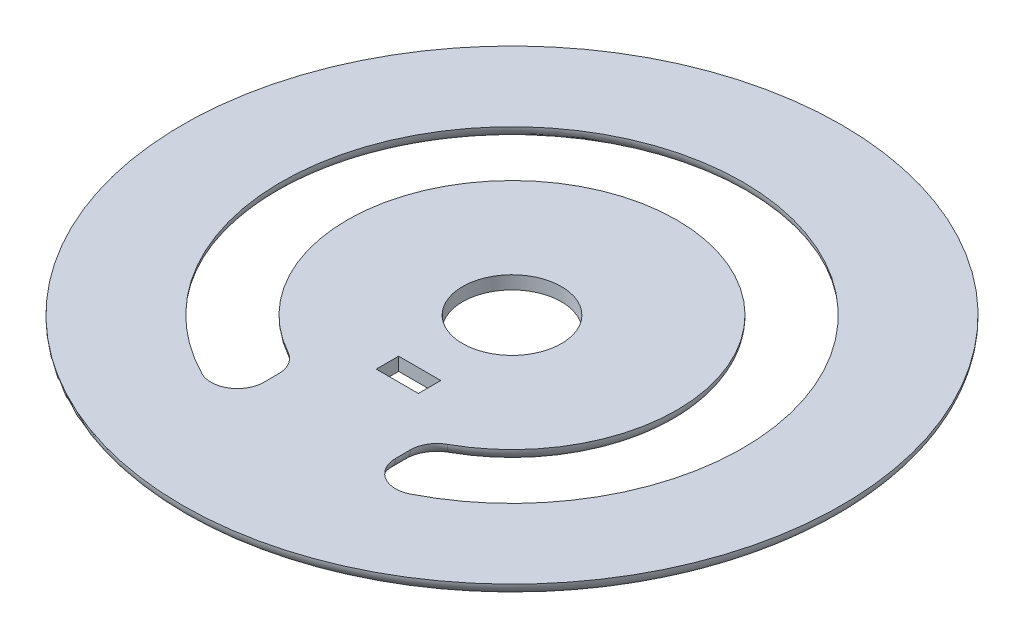
ISO-10303-21;
HEADER;
FILE_DESCRIPTION(('STEP AP214'),'2;1');
FILE_NAME('part.step','',(''),(''),'','','');
FILE_SCHEMA(('AUTOMOTIVE_DESIGN { 1 0 10303 214 1 1 1 1 }'));
ENDSEC;
DATA;
#1=APPLICATION_CONTEXT('core data for automotive mechanical design processes');
#2=APPLICATION_PROTOCOL_DEFINITION('international standard','automotive_design',2000,#1);
#3=PRODUCT_CONTEXT('',#1,'mechanical');
#4=PRODUCT('Part','Part','',(#3));
#5=PRODUCT_RELATED_PRODUCT_CATEGORY('part','',(#4));
#6=PRODUCT_DEFINITION_FORMATION('','',#4);
#7=PRODUCT_DEFINITION_CONTEXT('part definition',#1,'design');
#8=PRODUCT_DEFINITION('design','',#6,#7);
#9=PRODUCT_DEFINITION_SHAPE('','',#8);
#10=(LENGTH_UNIT() NAMED_UNIT(*) SI_UNIT(.MILLI.,.METRE.));
#11=(NAMED_UNIT(*) PLANE_ANGLE_UNIT() SI_UNIT($,.RADIAN.));
#12=(NAMED_UNIT(*) SI_UNIT($,.STERADIAN.) SOLID_ANGLE_UNIT());
#13=UNCERTAINTY_MEASURE_WITH_UNIT(LENGTH_MEASURE(1.E-05),#10,'distance_accuracy_value','');
#14=(GEOMETRIC_REPRESENTATION_CONTEXT(3) GLOBAL_UNCERTAINTY_ASSIGNED_CONTEXT((#13)) GLOBAL_UNIT_ASSIGNED_CONTEXT((#10,
#11,#12)) REPRESENTATION_CONTEXT('',''));
#15=CARTESIAN_POINT('',(0.,0.,0.));
#16=DIRECTION('',(0.,0.,1.));
#17=DIRECTION('',(1.,0.,0.));
#18=AXIS2_PLACEMENT_3D('',#15,#16,#17);
#19=CARTESIAN_POINT('',(0.,1.,0.));
#20=DIRECTION('',(0.,1.,0.));
#21=DIRECTION('',(0.,0.,1.));
#22=AXIS2_PLACEMENT_3D('',#19,#20,#21);
#23=PLANE('',#22);
#24=DIRECTION('',(1.,0.,0.));
#25=VECTOR('',#24,1.);
#26=CARTESIAN_POINT('',(-1.6,1.,8.7));
#27=LINE('',#26,#25);
#28=CARTESIAN_POINT('',(-1.6,1.,8.7));
#29=VERTEX_POINT('',#28);
#30=CARTESIAN_POINT('',(1.6,1.,8.7));
#31=VERTEX_POINT('',#30);
#32=EDGE_CURVE('E134',#29,#31,#27,.T.);
#33=ORIENTED_EDGE('',*,*,#32,.F.);
#34=DIRECTION('',(0.,0.,1.));
#35=VECTOR('',#34,1.);
#36=CARTESIAN_POINT('',(-1.6,1.,7.));
#37=LINE('',#36,#35);
#38=CARTESIAN_POINT('',(-1.6,1.,7.));
#39=VERTEX_POINT('',#38);
#40=EDGE_CURVE('E124',#39,#29,#37,.T.);
#41=ORIENTED_EDGE('',*,*,#40,.F.);
#42=DIRECTION('',(-1.,0.,0.));
#43=VECTOR('',#42,1.);
#44=CARTESIAN_POINT('',(-1.6,1.,7.));
#45=LINE('',#44,#43);
#46=CARTESIAN_POINT('',(1.6,1.,7.));
#47=VERTEX_POINT('',#46);
#48=EDGE_CURVE('E150',#47,#39,#45,.T.);
#49=ORIENTED_EDGE('',*,*,#48,.F.);
#50=DIRECTION('',(0.,0.,-1.));
#51=VECTOR('',#50,1.);
#52=CARTESIAN_POINT('',(1.6,1.,7.));
#53=LINE('',#52,#51);
#54=EDGE_CURVE('E148',#31,#47,#53,.T.);
#55=ORIENTED_EDGE('',*,*,#54,.F.);
#56=EDGE_LOOP('',(#33,#41,#49,#55));
#57=FACE_BOUND('',#56,.T.);
#58=CARTESIAN_POINT('',(0.,1.,0.));
#59=DIRECTION('',(0.,1.,0.));
#60=DIRECTION('',(0.,0.,1.));
#61=AXIS2_PLACEMENT_3D('',#58,#59,#60);
#62=CIRCLE('',#61,25.);
#63=CARTESIAN_POINT('',(0.,1.,25.));
#64=VERTEX_POINT('',#63);
#65=EDGE_CURVE('E142',#64,#64,#62,.T.);
#66=ORIENTED_EDGE('',*,*,#65,.T.);
#67=EDGE_LOOP('',(#66));
#68=FACE_BOUND('',#67,.T.);
#69=CARTESIAN_POINT('',(0.,1.,0.));
#70=DIRECTION('',(0.,1.,0.));
#71=DIRECTION('',(0.,0.,1.));
#72=AXIS2_PLACEMENT_3D('',#69,#70,#71);
#73=CIRCLE('',#72,3.75);
#74=CARTESIAN_POINT('',(0.,1.,3.75));
#75=VERTEX_POINT('',#74);
#76=EDGE_CURVE('E157',#75,#75,#73,.T.);
#77=ORIENTED_EDGE('',*,*,#76,.F.);
#78=EDGE_LOOP('',(#77));
#79=FACE_BOUND('',#78,.T.);
#80=DIRECTION('',(0.,0.,1.));
#81=VECTOR('',#80,1.);
#82=CARTESIAN_POINT('',(5.,1.,11.4564392373896));
#83=LINE('',#82,#81);
#84=CARTESIAN_POINT('',(5.,1.,12.6984250992003));
#85=VERTEX_POINT('',#84);
#86=CARTESIAN_POINT('',(5.,1.,13.8293166859393));
#87=VERTEX_POINT('',#86);
#88=EDGE_CURVE('E221',#85,#87,#83,.T.);
#89=ORIENTED_EDGE('',*,*,#88,.F.);
#90=CARTESIAN_POINT('',(7.,1.,12.6984250992003));
#91=DIRECTION('',(0.,1.,0.));
#92=DIRECTION('',(0.,0.,1.));
#93=AXIS2_PLACEMENT_3D('',#90,#91,#92);
#94=CIRCLE('',#93,2.);
#95=CARTESIAN_POINT('',(6.03448275862069,1.,10.9469181889658));
#96=VERTEX_POINT('',#95);
#97=EDGE_CURVE('E175',#85,#96,#94,.F.);
#98=ORIENTED_EDGE('',*,*,#97,.T.);
#99=CARTESIAN_POINT('',(0.,1.,0.));
#100=DIRECTION('',(0.,-1.,0.));
#101=DIRECTION('',(0.,0.,1.));
#102=AXIS2_PLACEMENT_3D('',#99,#100,#101);
#103=CIRCLE('',#102,12.5);
#104=CARTESIAN_POINT('',(-6.03448275862069,1.,10.9469181889658));
#105=VERTEX_POINT('',#104);
#106=EDGE_CURVE('E216',#105,#96,#103,.T.);
#107=ORIENTED_EDGE('',*,*,#106,.F.);
#108=CARTESIAN_POINT('',(-7.,1.,12.6984250992003));
#109=DIRECTION('',(0.,1.,0.));
#110=DIRECTION('',(0.,0.,1.));
#111=AXIS2_PLACEMENT_3D('',#108,#109,#110);
#112=CIRCLE('',#111,2.);
#113=CARTESIAN_POINT('',(-5.,1.,12.6984250992003));
#114=VERTEX_POINT('',#113);
#115=EDGE_CURVE('E177',#105,#114,#112,.F.);
#116=ORIENTED_EDGE('',*,*,#115,.T.);
#117=DIRECTION('',(0.,0.,-1.));
#118=VECTOR('',#117,1.);
#119=CARTESIAN_POINT('',(-5.,1.,11.4564392373896));
#120=LINE('',#119,#118);
#121=CARTESIAN_POINT('',(-5.,1.,13.8293166859393));
#122=VERTEX_POINT('',#121);
#123=EDGE_CURVE('E230',#122,#114,#120,.T.);
#124=ORIENTED_EDGE('',*,*,#123,.F.);
#125=CARTESIAN_POINT('',(-7.,1.,13.8293166859393));
#126=DIRECTION('',(0.,1.,0.));
#127=DIRECTION('',(0.,0.,1.));
#128=AXIS2_PLACEMENT_3D('',#125,#126,#127);
#129=CIRCLE('',#128,2.);
#130=CARTESIAN_POINT('',(-7.90322580645161,1.,15.6137446454154));
#131=VERTEX_POINT('',#130);
#132=EDGE_CURVE('E173',#122,#131,#129,.F.);
#133=ORIENTED_EDGE('',*,*,#132,.T.);
#134=CARTESIAN_POINT('',(0.,1.,0.));
#135=DIRECTION('',(0.,1.,0.));
#136=DIRECTION('',(0.,0.,1.));
#137=AXIS2_PLACEMENT_3D('',#134,#135,#136);
#138=CIRCLE('',#137,17.5);
#139=CARTESIAN_POINT('',(7.90322580645162,1.,15.6137446454154));
#140=VERTEX_POINT('',#139);
#141=EDGE_CURVE('E225',#140,#131,#138,.T.);
#142=ORIENTED_EDGE('',*,*,#141,.F.);
#143=CARTESIAN_POINT('',(7.,1.,13.8293166859393));
#144=DIRECTION('',(0.,1.,0.));
#145=DIRECTION('',(0.,0.,1.));
#146=AXIS2_PLACEMENT_3D('',#143,#144,#145);
#147=CIRCLE('',#146,2.);
#148=EDGE_CURVE('E170',#140,#87,#147,.F.);
#149=ORIENTED_EDGE('',*,*,#148,.T.);
#150=EDGE_LOOP('',(#89,#98,#107,#116,#124,#133,#142,#149));
#151=FACE_BOUND('',#150,.T.);
#152=ADVANCED_FACE('F34',(#57,#68,#79,#151),#23,.T.);
#153=CARTESIAN_POINT('',(0.,0.,0.));
#154=DIRECTION('',(0.,1.,0.));
#155=DIRECTION('',(0.,0.,1.));
#156=AXIS2_PLACEMENT_3D('',#153,#154,#155);
#157=PLANE('',#156);
#158=DIRECTION('',(0.,0.,1.));
#159=VECTOR('',#158,1.);
#160=CARTESIAN_POINT('',(4.,0.,13.8293166859393));
#161=LINE('',#160,#159);
#162=CARTESIAN_POINT('',(4.,0.,12.6984250992003));
#163=VERTEX_POINT('',#162);
#164=CARTESIAN_POINT('',(4.,0.,13.8293166859393));
#165=VERTEX_POINT('',#164);
#166=EDGE_CURVE('E43',#163,#165,#161,.T.);
#167=ORIENTED_EDGE('',*,*,#166,.T.);
#168=CARTESIAN_POINT('',(7.,0.,13.8293166859393));
#169=DIRECTION('',(0.,1.,0.));
#170=DIRECTION('',(0.,0.,1.));
#171=AXIS2_PLACEMENT_3D('',#168,#169,#170);
#172=CIRCLE('',#171,3.);
#173=CARTESIAN_POINT('',(8.35483870967742,0.,16.5059586251534));
#174=VERTEX_POINT('',#173);
#175=EDGE_CURVE('E11',#165,#174,#172,.T.);
#176=ORIENTED_EDGE('',*,*,#175,.T.);
#177=CARTESIAN_POINT('',(0.,0.,0.));
#178=DIRECTION('',(0.,1.,0.));
#179=DIRECTION('',(0.,0.,1.));
#180=AXIS2_PLACEMENT_3D('',#177,#178,#179);
#181=CIRCLE('',#180,18.5);
#182=CARTESIAN_POINT('',(-8.35483870967742,0.,16.5059586251534));
#183=VERTEX_POINT('',#182);
#184=EDGE_CURVE('E182',#174,#183,#181,.T.);
#185=ORIENTED_EDGE('',*,*,#184,.T.);
#186=CARTESIAN_POINT('',(-7.,0.,13.8293166859393));
#187=DIRECTION('',(0.,1.,0.));
#188=DIRECTION('',(0.,0.,1.));
#189=AXIS2_PLACEMENT_3D('',#186,#187,#188);
#190=CIRCLE('',#189,3.);
#191=CARTESIAN_POINT('',(-4.,0.,13.8293166859393));
#192=VERTEX_POINT('',#191);
#193=EDGE_CURVE('E184',#183,#192,#190,.T.);
#194=ORIENTED_EDGE('',*,*,#193,.T.);
#195=DIRECTION('',(0.,0.,-1.));
#196=VECTOR('',#195,1.);
#197=CARTESIAN_POINT('',(-4.,0.,12.6984250992003));
#198=LINE('',#197,#196);
#199=CARTESIAN_POINT('',(-4.,0.,12.6984250992003));
#200=VERTEX_POINT('',#199);
#201=EDGE_CURVE('E186',#192,#200,#198,.T.);
#202=ORIENTED_EDGE('',*,*,#201,.T.);
#203=CARTESIAN_POINT('',(-7.,0.,12.6984250992003));
#204=DIRECTION('',(0.,1.,0.));
#205=DIRECTION('',(0.,0.,1.));
#206=AXIS2_PLACEMENT_3D('',#203,#204,#205);
#207=CIRCLE('',#206,3.);
#208=CARTESIAN_POINT('',(-5.55172413793103,0.,10.0711647338485));
#209=VERTEX_POINT('',#208);
#210=EDGE_CURVE('E188',#200,#209,#207,.T.);
#211=ORIENTED_EDGE('',*,*,#210,.T.);
#212=CARTESIAN_POINT('',(0.,0.,0.));
#213=DIRECTION('',(0.,1.,0.));
#214=DIRECTION('',(0.,0.,1.));
#215=AXIS2_PLACEMENT_3D('',#212,#213,#214);
#216=CIRCLE('',#215,11.5);
#217=CARTESIAN_POINT('',(5.55172413793104,0.,10.0711647338485));
#218=VERTEX_POINT('',#217);
#219=EDGE_CURVE('E190',#209,#218,#216,.F.);
#220=ORIENTED_EDGE('',*,*,#219,.T.);
#221=CARTESIAN_POINT('',(7.,0.,12.6984250992003));
#222=DIRECTION('',(0.,1.,0.));
#223=DIRECTION('',(0.,0.,1.));
#224=AXIS2_PLACEMENT_3D('',#221,#222,#223);
#225=CIRCLE('',#224,3.);
#226=EDGE_CURVE('E54',#218,#163,#225,.T.);
#227=ORIENTED_EDGE('',*,*,#226,.T.);
#228=EDGE_LOOP('',(#167,#176,#185,#194,#202,#211,#220,#227));
#229=FACE_BOUND('',#228,.T.);
#230=CARTESIAN_POINT('',(0.,0.,0.));
#231=DIRECTION('',(0.,1.,0.));
#232=DIRECTION('',(0.,0.,1.));
#233=AXIS2_PLACEMENT_3D('',#230,#231,#232);
#234=CIRCLE('',#233,24.);
#235=CARTESIAN_POINT('',(0.,0.,24.));
#236=VERTEX_POINT('',#235);
#237=EDGE_CURVE('E179',#236,#236,#234,.F.);
#238=ORIENTED_EDGE('',*,*,#237,.T.);
#239=EDGE_LOOP('',(#238));
#240=FACE_BOUND('',#239,.T.);
#241=CARTESIAN_POINT('',(0.,0.,0.));
#242=DIRECTION('',(0.,1.,0.));
#243=DIRECTION('',(0.,0.,1.));
#244=AXIS2_PLACEMENT_3D('',#241,#242,#243);
#245=CIRCLE('',#244,3.75);
#246=CARTESIAN_POINT('',(0.,0.,3.75));
#247=VERTEX_POINT('',#246);
#248=EDGE_CURVE('E232',#247,#247,#245,.T.);
#249=ORIENTED_EDGE('',*,*,#248,.T.);
#250=EDGE_LOOP('',(#249));
#251=FACE_BOUND('',#250,.T.);
#252=DIRECTION('',(0.,0.,1.));
#253=VECTOR('',#252,1.);
#254=CARTESIAN_POINT('',(-1.6,0.,7.));
#255=LINE('',#254,#253);
#256=CARTESIAN_POINT('',(-1.6,0.,7.));
#257=VERTEX_POINT('',#256);
#258=CARTESIAN_POINT('',(-1.6,0.,8.7));
#259=VERTEX_POINT('',#258);
#260=EDGE_CURVE('E155',#257,#259,#255,.T.);
#261=ORIENTED_EDGE('',*,*,#260,.T.);
#262=DIRECTION('',(1.,0.,0.));
#263=VECTOR('',#262,1.);
#264=CARTESIAN_POINT('',(-1.6,0.,8.7));
#265=LINE('',#264,#263);
#266=CARTESIAN_POINT('',(1.6,0.,8.7));
#267=VERTEX_POINT('',#266);
#268=EDGE_CURVE('E141',#259,#267,#265,.T.);
#269=ORIENTED_EDGE('',*,*,#268,.T.);
#270=DIRECTION('',(0.,0.,-1.));
#271=VECTOR('',#270,1.);
#272=CARTESIAN_POINT('',(1.6,0.,7.));
#273=LINE('',#272,#271);
#274=CARTESIAN_POINT('',(1.6,0.,7.));
#275=VERTEX_POINT('',#274);
#276=EDGE_CURVE('E159',#267,#275,#273,.T.);
#277=ORIENTED_EDGE('',*,*,#276,.T.);
#278=DIRECTION('',(-1.,0.,0.));
#279=VECTOR('',#278,1.);
#280=CARTESIAN_POINT('',(-1.6,0.,7.));
#281=LINE('',#280,#279);
#282=EDGE_CURVE('E135',#275,#257,#281,.T.);
#283=ORIENTED_EDGE('',*,*,#282,.T.);
#284=EDGE_LOOP('',(#261,#269,#277,#283));
#285=FACE_BOUND('',#284,.T.);
#286=ADVANCED_FACE('F237',(#229,#240,#251,#285),#157,.F.);
#287=CARTESIAN_POINT('',(-1.6,1.,7.));
#288=DIRECTION('',(1.,0.,0.));
#289=DIRECTION('',(0.,0.,-1.));
#290=AXIS2_PLACEMENT_3D('',#287,#288,#289);
#291=PLANE('',#290);
#292=ORIENTED_EDGE('',*,*,#260,.F.);
#293=DIRECTION('',(0.,-1.,0.));
#294=VECTOR('',#293,1.);
#295=CARTESIAN_POINT('',(-1.6,1.,7.));
#296=LINE('',#295,#294);
#297=EDGE_CURVE('E130',#39,#257,#296,.T.);
#298=ORIENTED_EDGE('',*,*,#297,.F.);
#299=ORIENTED_EDGE('',*,*,#40,.T.);
#300=DIRECTION('',(0.,-1.,0.));
#301=VECTOR('',#300,1.);
#302=CARTESIAN_POINT('',(-1.6,1.,8.7));
#303=LINE('',#302,#301);
#304=EDGE_CURVE('E127',#29,#259,#303,.T.);
#305=ORIENTED_EDGE('',*,*,#304,.T.);
#306=EDGE_LOOP('',(#292,#298,#299,#305));
#307=FACE_BOUND('',#306,.T.);
#308=ADVANCED_FACE('F126',(#307),#291,.T.);
#309=CARTESIAN_POINT('',(-1.6,1.,8.7));
#310=DIRECTION('',(0.,0.,-1.));
#311=DIRECTION('',(-1.,0.,0.));
#312=AXIS2_PLACEMENT_3D('',#309,#310,#311);
#313=PLANE('',#312);
#314=ORIENTED_EDGE('',*,*,#268,.F.);
#315=ORIENTED_EDGE('',*,*,#304,.F.);
#316=ORIENTED_EDGE('',*,*,#32,.T.);
#317=DIRECTION('',(0.,-1.,0.));
#318=VECTOR('',#317,1.);
#319=CARTESIAN_POINT('',(1.6,1.,8.7));
#320=LINE('',#319,#318);
#321=EDGE_CURVE('E143',#31,#267,#320,.T.);
#322=ORIENTED_EDGE('',*,*,#321,.T.);
#323=EDGE_LOOP('',(#314,#315,#316,#322));
#324=FACE_BOUND('',#323,.T.);
#325=ADVANCED_FACE('F138',(#324),#313,.T.);
#326=CARTESIAN_POINT('',(1.6,1.,7.));
#327=DIRECTION('',(-1.,0.,0.));
#328=DIRECTION('',(0.,0.,1.));
#329=AXIS2_PLACEMENT_3D('',#326,#327,#328);
#330=PLANE('',#329);
#331=ORIENTED_EDGE('',*,*,#276,.F.);
#332=ORIENTED_EDGE('',*,*,#321,.F.);
#333=ORIENTED_EDGE('',*,*,#54,.T.);
#334=DIRECTION('',(0.,-1.,0.));
#335=VECTOR('',#334,1.);
#336=CARTESIAN_POINT('',(1.6,1.,7.));
#337=LINE('',#336,#335);
#338=EDGE_CURVE('E165',#47,#275,#337,.T.);
#339=ORIENTED_EDGE('',*,*,#338,.T.);
#340=EDGE_LOOP('',(#331,#332,#333,#339));
#341=FACE_BOUND('',#340,.T.);
#342=ADVANCED_FACE('F252',(#341),#330,.T.);
#343=CARTESIAN_POINT('',(-1.6,1.,7.));
#344=DIRECTION('',(0.,0.,1.));
#345=DIRECTION('',(1.,0.,0.));
#346=AXIS2_PLACEMENT_3D('',#343,#344,#345);
#347=PLANE('',#346);
#348=ORIENTED_EDGE('',*,*,#282,.F.);
#349=ORIENTED_EDGE('',*,*,#338,.F.);
#350=ORIENTED_EDGE('',*,*,#48,.T.);
#351=ORIENTED_EDGE('',*,*,#297,.T.);
#352=EDGE_LOOP('',(#348,#349,#350,#351));
#353=FACE_BOUND('',#352,.T.);
#354=ADVANCED_FACE('F243',(#353),#347,.T.);
#355=CARTESIAN_POINT('',(0.,1.,0.));
#356=DIRECTION('',(0.,-1.,0.));
#357=DIRECTION('',(0.,0.,-1.));
#358=AXIS2_PLACEMENT_3D('',#355,#356,#357);
#359=CYLINDRICAL_SURFACE('',#358,3.75);
#360=ORIENTED_EDGE('',*,*,#76,.T.);
#361=EDGE_LOOP('',(#360));
#362=FACE_BOUND('',#361,.T.);
#363=ORIENTED_EDGE('',*,*,#248,.F.);
#364=EDGE_LOOP('',(#363));
#365=FACE_BOUND('',#364,.T.);
#366=ADVANCED_FACE('F240',(#362,#365),#359,.F.);
#367=CARTESIAN_POINT('',(-7.,1.,12.6984250992003));
#368=DIRECTION('',(0.,1.,0.));
#369=DIRECTION('',(0.,0.,1.));
#370=AXIS2_PLACEMENT_3D('',#367,#368,#369);
#371=TOROIDAL_SURFACE('',#370,3.,1.);
#372=CARTESIAN_POINT('',(-4.,1.,12.6984250992003));
#373=DIRECTION('',(0.,0.,1.));
#374=DIRECTION('',(1.,0.,0.));
#375=AXIS2_PLACEMENT_3D('',#372,#373,#374);
#376=CIRCLE('',#375,1.);
#377=EDGE_CURVE('E209',#114,#200,#376,.T.);
#378=ORIENTED_EDGE('',*,*,#377,.F.);
#379=ORIENTED_EDGE('',*,*,#115,.F.);
#380=CARTESIAN_POINT('',(-5.55172413793103,1.,10.0711647338485));
#381=DIRECTION('',(-0.875753455117262,0.,-0.482758620689655));
#382=DIRECTION('',(-0.482758620689655,0.,0.875753455117262));
#383=AXIS2_PLACEMENT_3D('',#380,#381,#382);
#384=CIRCLE('',#383,1.);
#385=EDGE_CURVE('E38',#209,#105,#384,.T.);
#386=ORIENTED_EDGE('',*,*,#385,.F.);
#387=ORIENTED_EDGE('',*,*,#210,.F.);
#388=EDGE_LOOP('',(#378,#379,#386,#387));
#389=FACE_BOUND('',#388,.T.);
#390=ADVANCED_FACE('F242',(#389),#371,.T.);
#391=CARTESIAN_POINT('',(0.,1.,0.));
#392=DIRECTION('',(0.,1.,0.));
#393=DIRECTION('',(0.,0.,1.));
#394=AXIS2_PLACEMENT_3D('',#391,#392,#393);
#395=TOROIDAL_SURFACE('',#394,11.5,1.);
#396=ORIENTED_EDGE('',*,*,#385,.T.);
#397=ORIENTED_EDGE('',*,*,#106,.T.);
#398=CARTESIAN_POINT('',(5.55172413793104,1.,10.0711647338485));
#399=DIRECTION('',(-0.875753455117261,0.,0.482758620689656));
#400=DIRECTION('',(0.482758620689656,0.,0.875753455117261));
#401=AXIS2_PLACEMENT_3D('',#398,#399,#400);
#402=CIRCLE('',#401,1.);
#403=EDGE_CURVE('E207',#218,#96,#402,.T.);
#404=ORIENTED_EDGE('',*,*,#403,.F.);
#405=ORIENTED_EDGE('',*,*,#219,.F.);
#406=EDGE_LOOP('',(#396,#397,#404,#405));
#407=FACE_BOUND('',#406,.T.);
#408=ADVANCED_FACE('F250',(#407),#395,.T.);
#409=CARTESIAN_POINT('',(-3.99999999999999,1.,0.));
#410=DIRECTION('',(0.,0.,1.));
#411=DIRECTION('',(1.,0.,0.));
#412=AXIS2_PLACEMENT_3D('',#409,#410,#411);
#413=CYLINDRICAL_SURFACE('',#412,1.);
#414=ORIENTED_EDGE('',*,*,#377,.T.);
#415=ORIENTED_EDGE('',*,*,#201,.F.);
#416=CARTESIAN_POINT('',(-4.,1.,13.8293166859393));
#417=DIRECTION('',(0.,0.,1.));
#418=DIRECTION('',(1.,0.,0.));
#419=AXIS2_PLACEMENT_3D('',#416,#417,#418);
#420=CIRCLE('',#419,1.);
#421=EDGE_CURVE('E204',#122,#192,#420,.T.);
#422=ORIENTED_EDGE('',*,*,#421,.F.);
#423=ORIENTED_EDGE('',*,*,#123,.T.);
#424=EDGE_LOOP('',(#414,#415,#422,#423));
#425=FACE_BOUND('',#424,.T.);
#426=ADVANCED_FACE('F283',(#425),#413,.T.);
#427=CARTESIAN_POINT('',(7.,1.,12.6984250992003));
#428=DIRECTION('',(0.,1.,0.));
#429=DIRECTION('',(0.,0.,1.));
#430=AXIS2_PLACEMENT_3D('',#427,#428,#429);
#431=TOROIDAL_SURFACE('',#430,3.,1.);
#432=ORIENTED_EDGE('',*,*,#403,.T.);
#433=ORIENTED_EDGE('',*,*,#97,.F.);
#434=CARTESIAN_POINT('',(4.,1.,12.6984250992003));
#435=DIRECTION('',(0.,0.,1.));
#436=DIRECTION('',(1.,0.,0.));
#437=AXIS2_PLACEMENT_3D('',#434,#435,#436);
#438=CIRCLE('',#437,1.);
#439=EDGE_CURVE('E201',#163,#85,#438,.T.);
#440=ORIENTED_EDGE('',*,*,#439,.F.);
#441=ORIENTED_EDGE('',*,*,#226,.F.);
#442=EDGE_LOOP('',(#432,#433,#440,#441));
#443=FACE_BOUND('',#442,.T.);
#444=ADVANCED_FACE('F279',(#443),#431,.T.);
#445=CARTESIAN_POINT('',(-7.,1.,13.8293166859393));
#446=DIRECTION('',(0.,1.,0.));
#447=DIRECTION('',(0.,0.,1.));
#448=AXIS2_PLACEMENT_3D('',#445,#446,#447);
#449=TOROIDAL_SURFACE('',#448,3.,1.);
#450=ORIENTED_EDGE('',*,*,#421,.T.);
#451=ORIENTED_EDGE('',*,*,#193,.F.);
#452=CARTESIAN_POINT('',(-8.35483870967742,1.,16.5059586251534));
#453=DIRECTION('',(-0.892213979738021,0.,-0.451612903225807));
#454=DIRECTION('',(-0.451612903225807,0.,0.892213979738021));
#455=AXIS2_PLACEMENT_3D('',#452,#453,#454);
#456=CIRCLE('',#455,1.);
#457=EDGE_CURVE('E198',#131,#183,#456,.T.);
#458=ORIENTED_EDGE('',*,*,#457,.F.);
#459=ORIENTED_EDGE('',*,*,#132,.F.);
#460=EDGE_LOOP('',(#450,#451,#458,#459));
#461=FACE_BOUND('',#460,.T.);
#462=ADVANCED_FACE('F275',(#461),#449,.T.);
#463=CARTESIAN_POINT('',(4.,1.,0.));
#464=DIRECTION('',(0.,0.,-1.));
#465=DIRECTION('',(-1.,0.,0.));
#466=AXIS2_PLACEMENT_3D('',#463,#464,#465);
#467=CYLINDRICAL_SURFACE('',#466,1.);
#468=ORIENTED_EDGE('',*,*,#439,.T.);
#469=ORIENTED_EDGE('',*,*,#88,.T.);
#470=CARTESIAN_POINT('',(4.,1.,13.8293166859393));
#471=DIRECTION('',(0.,0.,1.));
#472=DIRECTION('',(1.,0.,0.));
#473=AXIS2_PLACEMENT_3D('',#470,#471,#472);
#474=CIRCLE('',#473,1.);
#475=EDGE_CURVE('E196',#165,#87,#474,.T.);
#476=ORIENTED_EDGE('',*,*,#475,.F.);
#477=ORIENTED_EDGE('',*,*,#166,.F.);
#478=EDGE_LOOP('',(#468,#469,#476,#477));
#479=FACE_BOUND('',#478,.T.);
#480=ADVANCED_FACE('F271',(#479),#467,.T.);
#481=CARTESIAN_POINT('',(0.,1.,0.));
#482=DIRECTION('',(0.,1.,0.));
#483=DIRECTION('',(0.,0.,1.));
#484=AXIS2_PLACEMENT_3D('',#481,#482,#483);
#485=TOROIDAL_SURFACE('',#484,18.5,1.);
#486=ORIENTED_EDGE('',*,*,#457,.T.);
#487=ORIENTED_EDGE('',*,*,#184,.F.);
#488=CARTESIAN_POINT('',(8.35483870967742,1.,16.5059586251534));
#489=DIRECTION('',(-0.892213979738021,0.,0.451612903225807));
#490=DIRECTION('',(0.451612903225807,0.,0.892213979738021));
#491=AXIS2_PLACEMENT_3D('',#488,#489,#490);
#492=CIRCLE('',#491,1.);
#493=EDGE_CURVE('E194',#140,#174,#492,.T.);
#494=ORIENTED_EDGE('',*,*,#493,.F.);
#495=ORIENTED_EDGE('',*,*,#141,.T.);
#496=EDGE_LOOP('',(#486,#487,#494,#495));
#497=FACE_BOUND('',#496,.T.);
#498=ADVANCED_FACE('F267',(#497),#485,.T.);
#499=CARTESIAN_POINT('',(7.,1.,13.8293166859393));
#500=DIRECTION('',(0.,1.,0.));
#501=DIRECTION('',(0.,0.,1.));
#502=AXIS2_PLACEMENT_3D('',#499,#500,#501);
#503=TOROIDAL_SURFACE('',#502,3.,1.);
#504=ORIENTED_EDGE('',*,*,#475,.T.);
#505=ORIENTED_EDGE('',*,*,#148,.F.);
#506=ORIENTED_EDGE('',*,*,#493,.T.);
#507=ORIENTED_EDGE('',*,*,#175,.F.);
#508=EDGE_LOOP('',(#504,#505,#506,#507));
#509=FACE_BOUND('',#508,.T.);
#510=ADVANCED_FACE('F264',(#509),#503,.T.);
#511=CARTESIAN_POINT('',(0.,1.,0.));
#512=DIRECTION('',(0.,1.,0.));
#513=DIRECTION('',(0.,0.,1.));
#514=AXIS2_PLACEMENT_3D('',#511,#512,#513);
#515=TOROIDAL_SURFACE('',#514,24.,1.);
#516=ORIENTED_EDGE('',*,*,#237,.F.);
#517=EDGE_LOOP('',(#516));
#518=FACE_BOUND('',#517,.T.);
#519=ORIENTED_EDGE('',*,*,#65,.F.);
#520=EDGE_LOOP('',(#519));
#521=FACE_BOUND('',#520,.T.);
#522=ADVANCED_FACE('F36',(#518,#521),#515,.T.);
#523=CLOSED_SHELL('',(#152,#286,#308,#325,#342,#354,#366,#390,#408,#426,#444,#462,#480,#498,
#510,#522));
#524=MANIFOLD_SOLID_BREP('B2',#523);
#525=ADVANCED_BREP_SHAPE_REPRESENTATION('',(#18,#524),#14);
#526=SHAPE_DEFINITION_REPRESENTATION(#9,#525);
ENDSEC;
END-ISO-10303-21;
